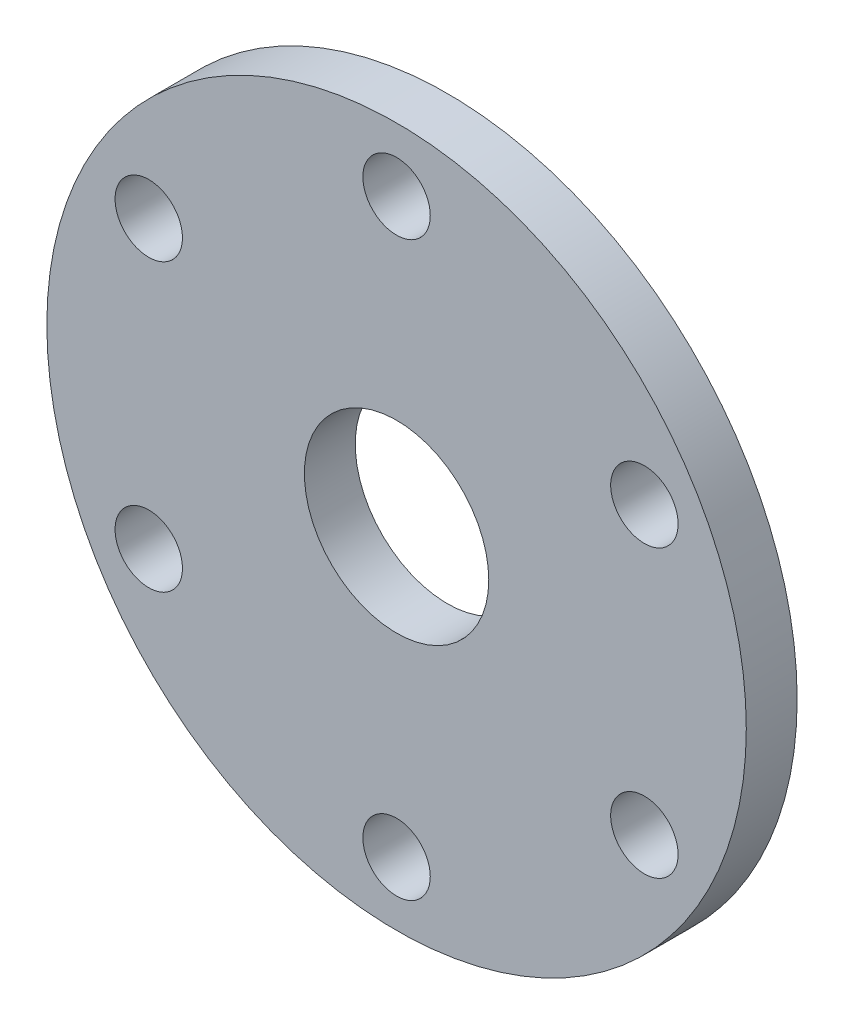
ISO-10303-21;
HEADER;
FILE_DESCRIPTION(('STEP AP214'),'2;1');
FILE_NAME('part.step','',(''),(''),'','','');
FILE_SCHEMA(('AUTOMOTIVE_DESIGN { 1 0 10303 214 1 1 1 1 }'));
ENDSEC;
DATA;
#1=APPLICATION_CONTEXT('core data for automotive mechanical design processes');
#2=APPLICATION_PROTOCOL_DEFINITION('international standard','automotive_design',2000,#1);
#3=PRODUCT_CONTEXT('',#1,'mechanical');
#4=PRODUCT('Part','Part','',(#3));
#5=PRODUCT_RELATED_PRODUCT_CATEGORY('part','',(#4));
#6=PRODUCT_DEFINITION_FORMATION('','',#4);
#7=PRODUCT_DEFINITION_CONTEXT('part definition',#1,'design');
#8=PRODUCT_DEFINITION('design','',#6,#7);
#9=PRODUCT_DEFINITION_SHAPE('','',#8);
#10=(LENGTH_UNIT() NAMED_UNIT(*) SI_UNIT(.MILLI.,.METRE.));
#11=(NAMED_UNIT(*) PLANE_ANGLE_UNIT() SI_UNIT($,.RADIAN.));
#12=(NAMED_UNIT(*) SI_UNIT($,.STERADIAN.) SOLID_ANGLE_UNIT());
#13=UNCERTAINTY_MEASURE_WITH_UNIT(LENGTH_MEASURE(1.E-05),#10,'distance_accuracy_value','');
#14=(GEOMETRIC_REPRESENTATION_CONTEXT(3) GLOBAL_UNCERTAINTY_ASSIGNED_CONTEXT((#13)) GLOBAL_UNIT_ASSIGNED_CONTEXT((#10,
#11,#12)) REPRESENTATION_CONTEXT('',''));
#15=CARTESIAN_POINT('',(0.,0.,0.));
#16=DIRECTION('',(0.,0.,1.));
#17=DIRECTION('',(1.,0.,0.));
#18=AXIS2_PLACEMENT_3D('',#15,#16,#17);
#19=CARTESIAN_POINT('',(0.,0.,4.));
#20=DIRECTION('',(0.,0.,1.));
#21=DIRECTION('',(1.,0.,0.));
#22=AXIS2_PLACEMENT_3D('',#19,#20,#21);
#23=PLANE('',#22);
#24=CARTESIAN_POINT('',(0.,0.,4.));
#25=DIRECTION('',(0.,0.,1.));
#26=DIRECTION('',(1.,0.,0.));
#27=AXIS2_PLACEMENT_3D('',#24,#25,#26);
#28=CIRCLE('',#27,7.25);
#29=CARTESIAN_POINT('',(7.25,0.,4.));
#30=VERTEX_POINT('',#29);
#31=EDGE_CURVE('E106',#30,#30,#28,.T.);
#32=ORIENTED_EDGE('',*,*,#31,.F.);
#33=EDGE_LOOP('',(#32));
#34=FACE_BOUND('',#33,.T.);
#35=CARTESIAN_POINT('',(-19.48557158515,-11.2499999999998,4.));
#36=DIRECTION('',(0.,0.,1.));
#37=DIRECTION('',(1.,0.,0.));
#38=AXIS2_PLACEMENT_3D('',#35,#36,#37);
#39=CIRCLE('',#38,2.65);
#40=CARTESIAN_POINT('',(-16.83557158515,-11.2499999999998,4.));
#41=VERTEX_POINT('',#40);
#42=EDGE_CURVE('E86',#41,#41,#39,.T.);
#43=ORIENTED_EDGE('',*,*,#42,.F.);
#44=EDGE_LOOP('',(#43));
#45=FACE_BOUND('',#44,.T.);
#46=CARTESIAN_POINT('',(19.4855715851498,-11.2500000000001,4.));
#47=DIRECTION('',(0.,0.,1.));
#48=DIRECTION('',(1.,0.,0.));
#49=AXIS2_PLACEMENT_3D('',#46,#47,#48);
#50=CIRCLE('',#49,2.65);
#51=CARTESIAN_POINT('',(22.1355715851498,-11.2500000000001,4.));
#52=VERTEX_POINT('',#51);
#53=EDGE_CURVE('E70',#52,#52,#50,.T.);
#54=ORIENTED_EDGE('',*,*,#53,.F.);
#55=EDGE_LOOP('',(#54));
#56=FACE_BOUND('',#55,.T.);
#57=CARTESIAN_POINT('',(0.,22.5,4.));
#58=DIRECTION('',(0.,0.,1.));
#59=DIRECTION('',(1.,0.,0.));
#60=AXIS2_PLACEMENT_3D('',#57,#58,#59);
#61=CIRCLE('',#60,2.65);
#62=CARTESIAN_POINT('',(2.65,22.5,4.));
#63=VERTEX_POINT('',#62);
#64=EDGE_CURVE('E56',#63,#63,#61,.T.);
#65=ORIENTED_EDGE('',*,*,#64,.F.);
#66=EDGE_LOOP('',(#65));
#67=FACE_BOUND('',#66,.T.);
#68=CARTESIAN_POINT('',(0.,0.,4.));
#69=DIRECTION('',(0.,0.,1.));
#70=DIRECTION('',(1.,0.,0.));
#71=AXIS2_PLACEMENT_3D('',#68,#69,#70);
#72=CIRCLE('',#71,27.5);
#73=CARTESIAN_POINT('',(27.5,0.,4.));
#74=VERTEX_POINT('',#73);
#75=EDGE_CURVE('E10',#74,#74,#72,.T.);
#76=ORIENTED_EDGE('',*,*,#75,.T.);
#77=EDGE_LOOP('',(#76));
#78=FACE_BOUND('',#77,.T.);
#79=CARTESIAN_POINT('',(19.4855715851499,11.25,4.));
#80=DIRECTION('',(0.,0.,1.));
#81=DIRECTION('',(1.,0.,0.));
#82=AXIS2_PLACEMENT_3D('',#79,#80,#81);
#83=CIRCLE('',#82,2.65);
#84=CARTESIAN_POINT('',(22.1355715851499,11.25,4.));
#85=VERTEX_POINT('',#84);
#86=EDGE_CURVE('E62',#85,#85,#83,.T.);
#87=ORIENTED_EDGE('',*,*,#86,.F.);
#88=EDGE_LOOP('',(#87));
#89=FACE_BOUND('',#88,.T.);
#90=CARTESIAN_POINT('',(-1.57116660247941E-13,-22.5,4.));
#91=DIRECTION('',(0.,0.,1.));
#92=DIRECTION('',(1.,0.,0.));
#93=AXIS2_PLACEMENT_3D('',#90,#91,#92);
#94=CIRCLE('',#93,2.65);
#95=CARTESIAN_POINT('',(2.64999999999984,-22.5,4.));
#96=VERTEX_POINT('',#95);
#97=EDGE_CURVE('E78',#96,#96,#94,.T.);
#98=ORIENTED_EDGE('',*,*,#97,.F.);
#99=EDGE_LOOP('',(#98));
#100=FACE_BOUND('',#99,.T.);
#101=CARTESIAN_POINT('',(-19.4855715851497,11.2500000000002,4.));
#102=DIRECTION('',(0.,0.,1.));
#103=DIRECTION('',(1.,0.,0.));
#104=AXIS2_PLACEMENT_3D('',#101,#102,#103);
#105=CIRCLE('',#104,2.65);
#106=CARTESIAN_POINT('',(-16.8355715851497,11.2500000000002,4.));
#107=VERTEX_POINT('',#106);
#108=EDGE_CURVE('E94',#107,#107,#105,.T.);
#109=ORIENTED_EDGE('',*,*,#108,.F.);
#110=EDGE_LOOP('',(#109));
#111=FACE_BOUND('',#110,.T.);
#112=ADVANCED_FACE('F43',(#34,#45,#56,#67,#78,#89,#100,#111),#23,.T.);
#113=CARTESIAN_POINT('',(0.,0.,0.));
#114=DIRECTION('',(0.,0.,1.));
#115=DIRECTION('',(1.,0.,0.));
#116=AXIS2_PLACEMENT_3D('',#113,#114,#115);
#117=PLANE('',#116);
#118=CARTESIAN_POINT('',(0.,0.,0.));
#119=DIRECTION('',(0.,0.,1.));
#120=DIRECTION('',(1.,0.,0.));
#121=AXIS2_PLACEMENT_3D('',#118,#119,#120);
#122=CIRCLE('',#121,7.25);
#123=CARTESIAN_POINT('',(7.25,0.,0.));
#124=VERTEX_POINT('',#123);
#125=EDGE_CURVE('E102',#124,#124,#122,.T.);
#126=ORIENTED_EDGE('',*,*,#125,.T.);
#127=EDGE_LOOP('',(#126));
#128=FACE_BOUND('',#127,.T.);
#129=CARTESIAN_POINT('',(0.,0.,0.));
#130=DIRECTION('',(0.,0.,1.));
#131=DIRECTION('',(1.,0.,0.));
#132=AXIS2_PLACEMENT_3D('',#129,#130,#131);
#133=CIRCLE('',#132,27.5);
#134=CARTESIAN_POINT('',(27.5,0.,0.));
#135=VERTEX_POINT('',#134);
#136=EDGE_CURVE('E47',#135,#135,#133,.T.);
#137=ORIENTED_EDGE('',*,*,#136,.F.);
#138=EDGE_LOOP('',(#137));
#139=FACE_BOUND('',#138,.T.);
#140=CARTESIAN_POINT('',(0.,22.5,0.));
#141=DIRECTION('',(0.,0.,1.));
#142=DIRECTION('',(1.,0.,0.));
#143=AXIS2_PLACEMENT_3D('',#140,#141,#142);
#144=CIRCLE('',#143,2.65);
#145=CARTESIAN_POINT('',(2.65,22.5,0.));
#146=VERTEX_POINT('',#145);
#147=EDGE_CURVE('E58',#146,#146,#144,.T.);
#148=ORIENTED_EDGE('',*,*,#147,.T.);
#149=EDGE_LOOP('',(#148));
#150=FACE_BOUND('',#149,.T.);
#151=CARTESIAN_POINT('',(19.4855715851499,11.25,0.));
#152=DIRECTION('',(0.,0.,1.));
#153=DIRECTION('',(1.,0.,0.));
#154=AXIS2_PLACEMENT_3D('',#151,#152,#153);
#155=CIRCLE('',#154,2.65);
#156=CARTESIAN_POINT('',(22.1355715851499,11.25,0.));
#157=VERTEX_POINT('',#156);
#158=EDGE_CURVE('E66',#157,#157,#155,.T.);
#159=ORIENTED_EDGE('',*,*,#158,.T.);
#160=EDGE_LOOP('',(#159));
#161=FACE_BOUND('',#160,.T.);
#162=CARTESIAN_POINT('',(19.4855715851498,-11.2500000000001,0.));
#163=DIRECTION('',(0.,0.,1.));
#164=DIRECTION('',(1.,0.,0.));
#165=AXIS2_PLACEMENT_3D('',#162,#163,#164);
#166=CIRCLE('',#165,2.65);
#167=CARTESIAN_POINT('',(22.1355715851498,-11.2500000000001,0.));
#168=VERTEX_POINT('',#167);
#169=EDGE_CURVE('E74',#168,#168,#166,.T.);
#170=ORIENTED_EDGE('',*,*,#169,.T.);
#171=EDGE_LOOP('',(#170));
#172=FACE_BOUND('',#171,.T.);
#173=CARTESIAN_POINT('',(-1.57116660247941E-13,-22.5,0.));
#174=DIRECTION('',(0.,0.,1.));
#175=DIRECTION('',(1.,0.,0.));
#176=AXIS2_PLACEMENT_3D('',#173,#174,#175);
#177=CIRCLE('',#176,2.65);
#178=CARTESIAN_POINT('',(2.64999999999984,-22.5,0.));
#179=VERTEX_POINT('',#178);
#180=EDGE_CURVE('E82',#179,#179,#177,.T.);
#181=ORIENTED_EDGE('',*,*,#180,.T.);
#182=EDGE_LOOP('',(#181));
#183=FACE_BOUND('',#182,.T.);
#184=CARTESIAN_POINT('',(-19.48557158515,-11.2499999999998,0.));
#185=DIRECTION('',(0.,0.,1.));
#186=DIRECTION('',(1.,0.,0.));
#187=AXIS2_PLACEMENT_3D('',#184,#185,#186);
#188=CIRCLE('',#187,2.65);
#189=CARTESIAN_POINT('',(-16.83557158515,-11.2499999999998,0.));
#190=VERTEX_POINT('',#189);
#191=EDGE_CURVE('E90',#190,#190,#188,.T.);
#192=ORIENTED_EDGE('',*,*,#191,.T.);
#193=EDGE_LOOP('',(#192));
#194=FACE_BOUND('',#193,.T.);
#195=CARTESIAN_POINT('',(-19.4855715851497,11.2500000000002,0.));
#196=DIRECTION('',(0.,0.,1.));
#197=DIRECTION('',(1.,0.,0.));
#198=AXIS2_PLACEMENT_3D('',#195,#196,#197);
#199=CIRCLE('',#198,2.65);
#200=CARTESIAN_POINT('',(-16.8355715851497,11.2500000000002,0.));
#201=VERTEX_POINT('',#200);
#202=EDGE_CURVE('E98',#201,#201,#199,.T.);
#203=ORIENTED_EDGE('',*,*,#202,.T.);
#204=EDGE_LOOP('',(#203));
#205=FACE_BOUND('',#204,.T.);
#206=ADVANCED_FACE('F114',(#128,#139,#150,#161,#172,#183,#194,#205),#117,.F.);
#207=CARTESIAN_POINT('',(0.,0.,4.));
#208=DIRECTION('',(0.,0.,-1.));
#209=DIRECTION('',(-1.,0.,0.));
#210=AXIS2_PLACEMENT_3D('',#207,#208,#209);
#211=CYLINDRICAL_SURFACE('',#210,27.5);
#212=ORIENTED_EDGE('',*,*,#75,.F.);
#213=EDGE_LOOP('',(#212));
#214=FACE_BOUND('',#213,.T.);
#215=ORIENTED_EDGE('',*,*,#136,.T.);
#216=EDGE_LOOP('',(#215));
#217=FACE_BOUND('',#216,.T.);
#218=ADVANCED_FACE('F45',(#214,#217),#211,.T.);
#219=CARTESIAN_POINT('',(0.,22.5,4.));
#220=DIRECTION('',(0.,0.,-1.));
#221=DIRECTION('',(-1.,0.,0.));
#222=AXIS2_PLACEMENT_3D('',#219,#220,#221);
#223=CYLINDRICAL_SURFACE('',#222,2.65);
#224=ORIENTED_EDGE('',*,*,#64,.T.);
#225=EDGE_LOOP('',(#224));
#226=FACE_BOUND('',#225,.T.);
#227=ORIENTED_EDGE('',*,*,#147,.F.);
#228=EDGE_LOOP('',(#227));
#229=FACE_BOUND('',#228,.T.);
#230=ADVANCED_FACE('F149',(#226,#229),#223,.F.);
#231=CARTESIAN_POINT('',(19.4855715851499,11.25,4.));
#232=DIRECTION('',(0.,0.,-1.));
#233=DIRECTION('',(-1.,0.,0.));
#234=AXIS2_PLACEMENT_3D('',#231,#232,#233);
#235=CYLINDRICAL_SURFACE('',#234,2.65);
#236=ORIENTED_EDGE('',*,*,#86,.T.);
#237=EDGE_LOOP('',(#236));
#238=FACE_BOUND('',#237,.T.);
#239=ORIENTED_EDGE('',*,*,#158,.F.);
#240=EDGE_LOOP('',(#239));
#241=FACE_BOUND('',#240,.T.);
#242=ADVANCED_FACE('F154',(#238,#241),#235,.F.);
#243=CARTESIAN_POINT('',(19.4855715851498,-11.2500000000001,4.));
#244=DIRECTION('',(0.,0.,-1.));
#245=DIRECTION('',(-1.,0.,0.));
#246=AXIS2_PLACEMENT_3D('',#243,#244,#245);
#247=CYLINDRICAL_SURFACE('',#246,2.65);
#248=ORIENTED_EDGE('',*,*,#53,.T.);
#249=EDGE_LOOP('',(#248));
#250=FACE_BOUND('',#249,.T.);
#251=ORIENTED_EDGE('',*,*,#169,.F.);
#252=EDGE_LOOP('',(#251));
#253=FACE_BOUND('',#252,.T.);
#254=ADVANCED_FACE('F158',(#250,#253),#247,.F.);
#255=CARTESIAN_POINT('',(-1.57116660247941E-13,-22.5,4.));
#256=DIRECTION('',(0.,0.,-1.));
#257=DIRECTION('',(-1.,0.,0.));
#258=AXIS2_PLACEMENT_3D('',#255,#256,#257);
#259=CYLINDRICAL_SURFACE('',#258,2.65);
#260=ORIENTED_EDGE('',*,*,#97,.T.);
#261=EDGE_LOOP('',(#260));
#262=FACE_BOUND('',#261,.T.);
#263=ORIENTED_EDGE('',*,*,#180,.F.);
#264=EDGE_LOOP('',(#263));
#265=FACE_BOUND('',#264,.T.);
#266=ADVANCED_FACE('F162',(#262,#265),#259,.F.);
#267=CARTESIAN_POINT('',(-19.48557158515,-11.2499999999998,4.));
#268=DIRECTION('',(0.,0.,-1.));
#269=DIRECTION('',(-1.,0.,0.));
#270=AXIS2_PLACEMENT_3D('',#267,#268,#269);
#271=CYLINDRICAL_SURFACE('',#270,2.65);
#272=ORIENTED_EDGE('',*,*,#42,.T.);
#273=EDGE_LOOP('',(#272));
#274=FACE_BOUND('',#273,.T.);
#275=ORIENTED_EDGE('',*,*,#191,.F.);
#276=EDGE_LOOP('',(#275));
#277=FACE_BOUND('',#276,.T.);
#278=ADVANCED_FACE('F141',(#274,#277),#271,.F.);
#279=CARTESIAN_POINT('',(-19.4855715851497,11.2500000000002,4.));
#280=DIRECTION('',(0.,0.,-1.));
#281=DIRECTION('',(-1.,0.,0.));
#282=AXIS2_PLACEMENT_3D('',#279,#280,#281);
#283=CYLINDRICAL_SURFACE('',#282,2.65);
#284=ORIENTED_EDGE('',*,*,#108,.T.);
#285=EDGE_LOOP('',(#284));
#286=FACE_BOUND('',#285,.T.);
#287=ORIENTED_EDGE('',*,*,#202,.F.);
#288=EDGE_LOOP('',(#287));
#289=FACE_BOUND('',#288,.T.);
#290=ADVANCED_FACE('F120',(#286,#289),#283,.F.);
#291=CARTESIAN_POINT('',(0.,0.,0.));
#292=DIRECTION('',(0.,0.,1.));
#293=DIRECTION('',(1.,0.,0.));
#294=AXIS2_PLACEMENT_3D('',#291,#292,#293);
#295=CYLINDRICAL_SURFACE('',#294,7.25);
#296=ORIENTED_EDGE('',*,*,#125,.F.);
#297=EDGE_LOOP('',(#296));
#298=FACE_BOUND('',#297,.T.);
#299=ORIENTED_EDGE('',*,*,#31,.T.);
#300=EDGE_LOOP('',(#299));
#301=FACE_BOUND('',#300,.T.);
#302=ADVANCED_FACE('F117',(#298,#301),#295,.F.);
#303=CLOSED_SHELL('',(#112,#206,#218,#230,#242,#254,#266,#278,#290,#302));
#304=MANIFOLD_SOLID_BREP('B2',#303);
#305=ADVANCED_BREP_SHAPE_REPRESENTATION('',(#18,#304),#14);
#306=SHAPE_DEFINITION_REPRESENTATION(#9,#305);
ENDSEC;
END-ISO-10303-21;
